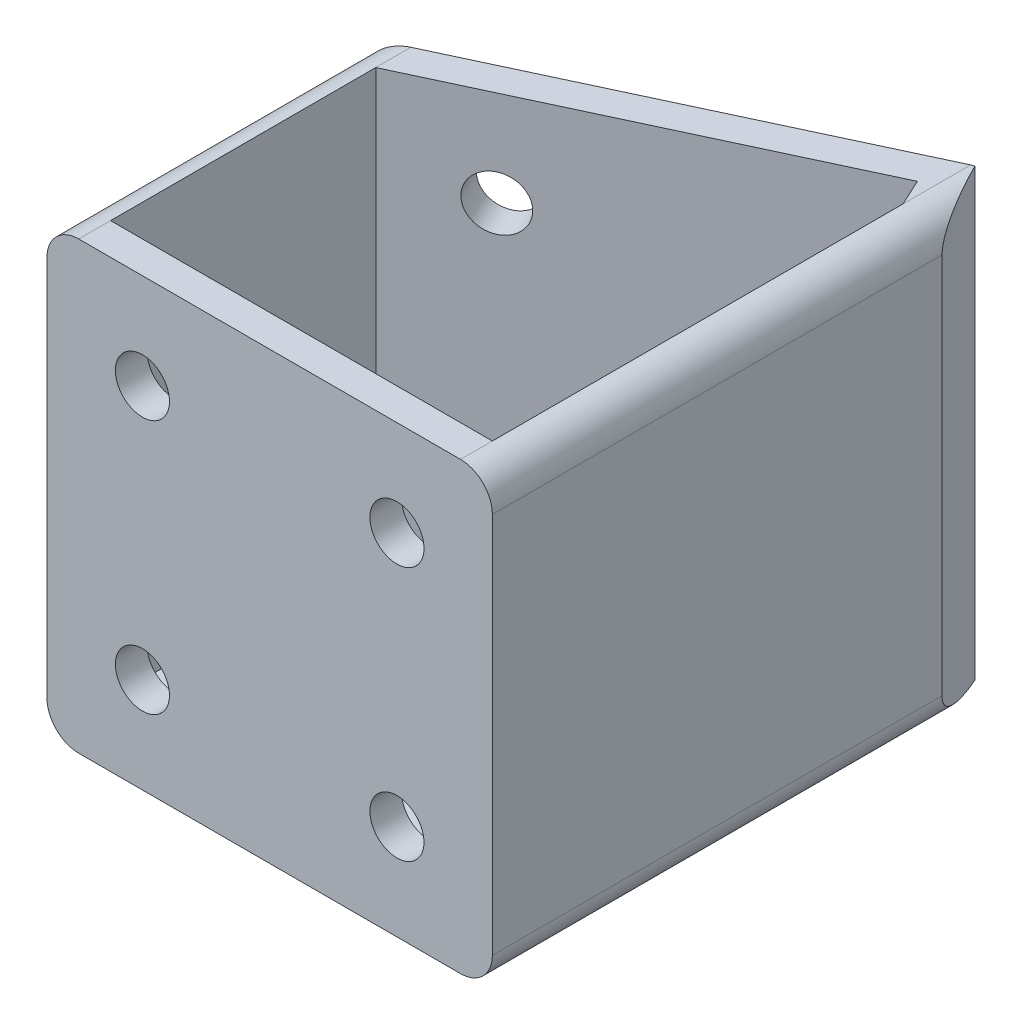
ISO-10303-21;
HEADER;
FILE_DESCRIPTION(('STEP AP214'),'2;1');
FILE_NAME('part.step','',(''),(''),'','','');
FILE_SCHEMA(('AUTOMOTIVE_DESIGN { 1 0 10303 214 1 1 1 1 }'));
ENDSEC;
DATA;
#1=APPLICATION_CONTEXT('core data for automotive mechanical design processes');
#2=APPLICATION_PROTOCOL_DEFINITION('international standard','automotive_design',2000,#1);
#3=PRODUCT_CONTEXT('',#1,'mechanical');
#4=PRODUCT('Part','Part','',(#3));
#5=PRODUCT_RELATED_PRODUCT_CATEGORY('part','',(#4));
#6=PRODUCT_DEFINITION_FORMATION('','',#4);
#7=PRODUCT_DEFINITION_CONTEXT('part definition',#1,'design');
#8=PRODUCT_DEFINITION('design','',#6,#7);
#9=PRODUCT_DEFINITION_SHAPE('','',#8);
#10=(LENGTH_UNIT() NAMED_UNIT(*) SI_UNIT(.MILLI.,.METRE.));
#11=(NAMED_UNIT(*) PLANE_ANGLE_UNIT() SI_UNIT($,.RADIAN.));
#12=(NAMED_UNIT(*) SI_UNIT($,.STERADIAN.) SOLID_ANGLE_UNIT());
#13=UNCERTAINTY_MEASURE_WITH_UNIT(LENGTH_MEASURE(1.E-05),#10,'distance_accuracy_value','');
#14=(GEOMETRIC_REPRESENTATION_CONTEXT(3) GLOBAL_UNCERTAINTY_ASSIGNED_CONTEXT((#13)) GLOBAL_UNIT_ASSIGNED_CONTEXT((#10,
#11,#12)) REPRESENTATION_CONTEXT('',''));
#15=CARTESIAN_POINT('',(0.,0.,0.));
#16=DIRECTION('',(0.,0.,1.));
#17=DIRECTION('',(1.,0.,0.));
#18=AXIS2_PLACEMENT_3D('',#15,#16,#17);
#19=CARTESIAN_POINT('',(-14.,14.,33.));
#20=DIRECTION('',(0.,-1.,0.));
#21=DIRECTION('',(0.,0.,-1.));
#22=AXIS2_PLACEMENT_3D('',#19,#20,#21);
#23=PLANE('',#22);
#24=DIRECTION('',(-0.4226182617407,0.,-0.90630778703665));
#25=VECTOR('',#24,1.);
#26=CARTESIAN_POINT('',(7.87428211965917,14.,-3.67183805487005));
#27=LINE('',#26,#25);
#28=CARTESIAN_POINT('',(12.,14.,5.17579249159087));
#29=VERTEX_POINT('',#28);
#30=CARTESIAN_POINT('',(11.2200053753348,14.,3.5030886210361));
#31=VERTEX_POINT('',#30);
#32=EDGE_CURVE('E170',#29,#31,#27,.T.);
#33=ORIENTED_EDGE('',*,*,#32,.F.);
#34=DIRECTION('',(0.,0.,-1.));
#35=VECTOR('',#34,1.);
#36=CARTESIAN_POINT('',(12.,14.,33.));
#37=LINE('',#36,#35);
#38=CARTESIAN_POINT('',(12.,14.,0.93261531631));
#39=VERTEX_POINT('',#38);
#40=EDGE_CURVE('E238',#29,#39,#37,.T.);
#41=ORIENTED_EDGE('',*,*,#40,.T.);
#42=DIRECTION('',(0.90630778703665,0.,-0.4226182617407));
#43=VECTOR('',#42,1.);
#44=CARTESIAN_POINT('',(-21.6387598470747,14.,16.6186266438378));
#45=LINE('',#44,#43);
#46=CARTESIAN_POINT('',(-12.,14.,12.12399911203));
#47=VERTEX_POINT('',#46);
#48=EDGE_CURVE('E192',#47,#39,#45,.T.);
#49=ORIENTED_EDGE('',*,*,#48,.F.);
#50=DIRECTION('',(0.,0.,-1.));
#51=VECTOR('',#50,1.);
#52=CARTESIAN_POINT('',(-12.,14.,33.));
#53=LINE('',#52,#51);
#54=CARTESIAN_POINT('',(-12.,14.,14.330754949955));
#55=VERTEX_POINT('',#54);
#56=EDGE_CURVE('E235',#47,#55,#53,.F.);
#57=ORIENTED_EDGE('',*,*,#56,.T.);
#58=DIRECTION('',(0.90630778703665,0.,-0.4226182617407));
#59=VECTOR('',#58,1.);
#60=CARTESIAN_POINT('',(-20.7935233235933,14.,18.4312422179111));
#61=LINE('',#60,#59);
#62=EDGE_CURVE('E148',#55,#31,#61,.T.);
#63=ORIENTED_EDGE('',*,*,#62,.T.);
#64=EDGE_LOOP('',(#33,#41,#49,#57,#63));
#65=FACE_BOUND('',#64,.T.);
#66=ADVANCED_FACE('F38',(#65),#23,.F.);
#67=CARTESIAN_POINT('',(14.,14.,33.));
#68=DIRECTION('',(-1.,0.,0.));
#69=DIRECTION('',(0.,-1.,0.));
#70=AXIS2_PLACEMENT_3D('',#67,#68,#69);
#71=PLANE('',#70);
#72=DIRECTION('',(0.,-1.,0.));
#73=VECTOR('',#72,1.);
#74=CARTESIAN_POINT('',(14.,14.,4.73240316630498));
#75=LINE('',#74,#73);
#76=CARTESIAN_POINT('',(14.,12.,4.73240316630498));
#77=VERTEX_POINT('',#76);
#78=CARTESIAN_POINT('',(14.,-12.,4.73240316630498));
#79=VERTEX_POINT('',#78);
#80=EDGE_CURVE('E181',#77,#79,#75,.T.);
#81=ORIENTED_EDGE('',*,*,#80,.F.);
#82=DIRECTION('',(0.,0.,-1.));
#83=VECTOR('',#82,1.);
#84=CARTESIAN_POINT('',(14.,12.,33.));
#85=LINE('',#84,#83);
#86=CARTESIAN_POINT('',(14.,12.,33.));
#87=VERTEX_POINT('',#86);
#88=EDGE_CURVE('E207',#77,#87,#85,.F.);
#89=ORIENTED_EDGE('',*,*,#88,.T.);
#90=DIRECTION('',(0.,1.,0.));
#91=VECTOR('',#90,1.);
#92=CARTESIAN_POINT('',(14.,14.,33.));
#93=LINE('',#92,#91);
#94=CARTESIAN_POINT('',(14.,-12.,33.));
#95=VERTEX_POINT('',#94);
#96=EDGE_CURVE('E195',#95,#87,#93,.T.);
#97=ORIENTED_EDGE('',*,*,#96,.F.);
#98=DIRECTION('',(0.,0.,-1.));
#99=VECTOR('',#98,1.);
#100=CARTESIAN_POINT('',(14.,-12.,33.));
#101=LINE('',#100,#99);
#102=EDGE_CURVE('E209',#95,#79,#101,.T.);
#103=ORIENTED_EDGE('',*,*,#102,.T.);
#104=EDGE_LOOP('',(#81,#89,#97,#103));
#105=FACE_BOUND('',#104,.T.);
#106=ADVANCED_FACE('F273',(#105),#71,.F.);
#107=CARTESIAN_POINT('',(2.50048673219423,0.,5.36231110183285));
#108=DIRECTION('',(-0.4226182617407,0.,-0.90630778703665));
#109=DIRECTION('',(-0.90630778703665,0.,0.4226182617407));
#110=AXIS2_PLACEMENT_3D('',#107,#108,#109);
#111=PLANE('',#110);
#112=CARTESIAN_POINT('',(-7.65584549074345,-8.,10.0982865961551));
#113=DIRECTION('',(-0.4226182617407,0.,-0.90630778703665));
#114=DIRECTION('',(-0.90630778703665,0.,0.4226182617407));
#115=AXIS2_PLACEMENT_3D('',#112,#113,#114);
#116=CIRCLE('',#115,1.59034702456793);
#117=CARTESIAN_POINT('',(-9.09718938319993,-8.,10.7703962912425));
#118=VERTEX_POINT('',#117);
#119=EDGE_CURVE('E337',#118,#118,#116,.T.);
#120=ORIENTED_EDGE('',*,*,#119,.F.);
#121=EDGE_LOOP('',(#120));
#122=FACE_BOUND('',#121,.T.);
#123=CARTESIAN_POINT('',(-7.65584549074345,8.,10.0982865961551));
#124=DIRECTION('',(-0.4226182617407,0.,-0.90630778703665));
#125=DIRECTION('',(-0.90630778703665,0.,0.4226182617407));
#126=AXIS2_PLACEMENT_3D('',#123,#124,#125);
#127=CIRCLE('',#126,1.7);
#128=CARTESIAN_POINT('',(-9.19656872870575,8.,10.8167376411143));
#129=VERTEX_POINT('',#128);
#130=EDGE_CURVE('E341',#129,#129,#127,.T.);
#131=ORIENTED_EDGE('',*,*,#130,.F.);
#132=EDGE_LOOP('',(#131));
#133=FACE_BOUND('',#132,.T.);
#134=CARTESIAN_POINT('',(8.20454078239792,0.,2.70246701569283));
#135=DIRECTION('',(-0.4226182617407,0.,-0.90630778703665));
#136=DIRECTION('',(-0.90630778703665,0.,0.4226182617407));
#137=AXIS2_PLACEMENT_3D('',#134,#135,#136);
#138=CIRCLE('',#137,1.7);
#139=CARTESIAN_POINT('',(6.66381754443561,0.,3.42091806065203));
#140=VERTEX_POINT('',#139);
#141=EDGE_CURVE('E344',#140,#140,#138,.T.);
#142=ORIENTED_EDGE('',*,*,#141,.F.);
#143=EDGE_LOOP('',(#142));
#144=FACE_BOUND('',#143,.T.);
#145=CARTESIAN_POINT('',(12.,12.,0.932615316310004));
#146=DIRECTION('',(-0.4226182617407,0.,-0.90630778703665));
#147=DIRECTION('',(0.90630778703665,0.,-0.4226182617407));
#148=AXIS2_PLACEMENT_3D('',#145,#146,#147);
#149=ELLIPSE('',#148,2.20675583792498,2.);
#150=CARTESIAN_POINT('',(12.1873844259267,13.991202419876,0.845236523481403));
#151=VERTEX_POINT('',#150);
#152=EDGE_CURVE('E216',#39,#151,#149,.T.);
#153=ORIENTED_EDGE('',*,*,#152,.T.);
#154=DIRECTION('',(0.,-1.,0.));
#155=VECTOR('',#154,1.);
#156=CARTESIAN_POINT('',(12.1873844259267,0.,0.8452365234814));
#157=LINE('',#156,#155);
#158=CARTESIAN_POINT('',(12.1873844259267,-13.991202419876,0.8452365234814));
#159=VERTEX_POINT('',#158);
#160=EDGE_CURVE('E61',#151,#159,#157,.T.);
#161=ORIENTED_EDGE('',*,*,#160,.T.);
#162=CARTESIAN_POINT('',(12.,-12.,0.932615316310004));
#163=DIRECTION('',(-0.4226182617407,0.,-0.90630778703665));
#164=DIRECTION('',(0.90630778703665,0.,-0.4226182617407));
#165=AXIS2_PLACEMENT_3D('',#162,#163,#164);
#166=ELLIPSE('',#165,2.20675583792498,2.);
#167=CARTESIAN_POINT('',(12.,-14.,0.93261531631));
#168=VERTEX_POINT('',#167);
#169=EDGE_CURVE('E219',#159,#168,#166,.T.);
#170=ORIENTED_EDGE('',*,*,#169,.T.);
#171=DIRECTION('',(-0.90630778703665,0.,0.4226182617407));
#172=VECTOR('',#171,1.);
#173=CARTESIAN_POINT('',(-21.6387598470747,-14.,16.6186266438378));
#174=LINE('',#173,#172);
#175=CARTESIAN_POINT('',(-12.,-14.,12.12399911203));
#176=VERTEX_POINT('',#175);
#177=EDGE_CURVE('E186',#168,#176,#174,.T.);
#178=ORIENTED_EDGE('',*,*,#177,.T.);
#179=CARTESIAN_POINT('',(-12.,-12.,12.12399911203));
#180=DIRECTION('',(-0.4226182617407,0.,-0.90630778703665));
#181=DIRECTION('',(0.90630778703665,0.,-0.4226182617407));
#182=AXIS2_PLACEMENT_3D('',#179,#180,#181);
#183=ELLIPSE('',#182,2.20675583792498,2.);
#184=CARTESIAN_POINT('',(-14.,-12.,13.05661442834));
#185=VERTEX_POINT('',#184);
#186=EDGE_CURVE('E212',#176,#185,#183,.T.);
#187=ORIENTED_EDGE('',*,*,#186,.T.);
#188=DIRECTION('',(0.,1.,0.));
#189=VECTOR('',#188,1.);
#190=CARTESIAN_POINT('',(-14.,14.,13.05661442834));
#191=LINE('',#190,#189);
#192=CARTESIAN_POINT('',(-14.,12.,13.05661442834));
#193=VERTEX_POINT('',#192);
#194=EDGE_CURVE('E189',#185,#193,#191,.T.);
#195=ORIENTED_EDGE('',*,*,#194,.T.);
#196=CARTESIAN_POINT('',(-12.,12.,12.12399911203));
#197=DIRECTION('',(-0.4226182617407,0.,-0.90630778703665));
#198=DIRECTION('',(0.90630778703665,0.,-0.4226182617407));
#199=AXIS2_PLACEMENT_3D('',#196,#197,#198);
#200=ELLIPSE('',#199,2.20675583792498,2.);
#201=EDGE_CURVE('E214',#193,#47,#200,.T.);
#202=ORIENTED_EDGE('',*,*,#201,.T.);
#203=ORIENTED_EDGE('',*,*,#48,.T.);
#204=EDGE_LOOP('',(#153,#161,#170,#178,#187,#195,#202,#203));
#205=FACE_BOUND('',#204,.T.);
#206=ADVANCED_FACE('F253',(#122,#133,#144,#205),#111,.T.);
#207=CARTESIAN_POINT('',(12.,-12.,33.));
#208=DIRECTION('',(0.,0.,-1.));
#209=DIRECTION('',(-1.,0.,0.));
#210=AXIS2_PLACEMENT_3D('',#207,#208,#209);
#211=CYLINDRICAL_SURFACE('',#210,2.);
#212=ORIENTED_EDGE('',*,*,#169,.F.);
#213=CARTESIAN_POINT('',(12.,-12.,0.44338932528587));
#214=DIRECTION('',(0.90630778703665,0.,-0.4226182617407));
#215=DIRECTION('',(-0.4226182617407,0.,-0.90630778703665));
#216=AXIS2_PLACEMENT_3D('',#213,#214,#215);
#217=ELLIPSE('',#216,4.73240316630499,2.);
#218=EDGE_CURVE('E183',#159,#79,#217,.F.);
#219=ORIENTED_EDGE('',*,*,#218,.T.);
#220=ORIENTED_EDGE('',*,*,#102,.F.);
#221=CARTESIAN_POINT('',(12.,-12.,33.));
#222=DIRECTION('',(0.,0.,1.));
#223=DIRECTION('',(1.,0.,0.));
#224=AXIS2_PLACEMENT_3D('',#221,#222,#223);
#225=CIRCLE('',#224,2.);
#226=CARTESIAN_POINT('',(12.,-14.,33.));
#227=VERTEX_POINT('',#226);
#228=EDGE_CURVE('E232',#227,#95,#225,.T.);
#229=ORIENTED_EDGE('',*,*,#228,.F.);
#230=DIRECTION('',(0.,0.,-1.));
#231=VECTOR('',#230,1.);
#232=CARTESIAN_POINT('',(12.,-14.,33.));
#233=LINE('',#232,#231);
#234=EDGE_CURVE('E224',#168,#227,#233,.F.);
#235=ORIENTED_EDGE('',*,*,#234,.F.);
#236=EDGE_LOOP('',(#212,#219,#220,#229,#235));
#237=FACE_BOUND('',#236,.T.);
#238=ADVANCED_FACE('F270',(#237),#211,.T.);
#239=CARTESIAN_POINT('',(12.,12.,33.));
#240=DIRECTION('',(0.,0.,-1.));
#241=DIRECTION('',(-1.,0.,0.));
#242=AXIS2_PLACEMENT_3D('',#239,#240,#241);
#243=CYLINDRICAL_SURFACE('',#242,2.);
#244=ORIENTED_EDGE('',*,*,#88,.F.);
#245=CARTESIAN_POINT('',(12.,12.,0.443389325285877));
#246=DIRECTION('',(0.90630778703665,0.,-0.4226182617407));
#247=DIRECTION('',(-0.4226182617407,0.,-0.90630778703665));
#248=AXIS2_PLACEMENT_3D('',#245,#246,#247);
#249=ELLIPSE('',#248,4.73240316630499,2.);
#250=EDGE_CURVE('E11',#77,#151,#249,.F.);
#251=ORIENTED_EDGE('',*,*,#250,.T.);
#252=ORIENTED_EDGE('',*,*,#152,.F.);
#253=ORIENTED_EDGE('',*,*,#40,.F.);
#254=DIRECTION('',(0.,0.,-1.));
#255=VECTOR('',#254,1.);
#256=CARTESIAN_POINT('',(12.,14.,33.));
#257=LINE('',#256,#255);
#258=CARTESIAN_POINT('',(12.,14.,31.));
#259=VERTEX_POINT('',#258);
#260=EDGE_CURVE('E172',#259,#29,#257,.T.);
#261=ORIENTED_EDGE('',*,*,#260,.F.);
#262=CARTESIAN_POINT('',(12.,14.,33.));
#263=VERTEX_POINT('',#262);
#264=EDGE_CURVE('E239',#263,#259,#37,.T.);
#265=ORIENTED_EDGE('',*,*,#264,.F.);
#266=CARTESIAN_POINT('',(12.,12.,33.));
#267=DIRECTION('',(0.,0.,1.));
#268=DIRECTION('',(1.,0.,0.));
#269=AXIS2_PLACEMENT_3D('',#266,#267,#268);
#270=CIRCLE('',#269,2.);
#271=EDGE_CURVE('E230',#87,#263,#270,.T.);
#272=ORIENTED_EDGE('',*,*,#271,.F.);
#273=EDGE_LOOP('',(#244,#251,#252,#253,#261,#265,#272));
#274=FACE_BOUND('',#273,.T.);
#275=ADVANCED_FACE('F279',(#274),#243,.T.);
#276=ORIENTED_EDGE('',*,*,#264,.T.);
#277=DIRECTION('',(-1.,0.,0.));
#278=VECTOR('',#277,1.);
#279=CARTESIAN_POINT('',(-14.,14.,31.));
#280=LINE('',#279,#278);
#281=CARTESIAN_POINT('',(-12.,14.,31.));
#282=VERTEX_POINT('',#281);
#283=EDGE_CURVE('E145',#259,#282,#280,.T.);
#284=ORIENTED_EDGE('',*,*,#283,.T.);
#285=CARTESIAN_POINT('',(-12.,14.,33.));
#286=VERTEX_POINT('',#285);
#287=EDGE_CURVE('E234',#282,#286,#53,.F.);
#288=ORIENTED_EDGE('',*,*,#287,.T.);
#289=DIRECTION('',(-1.,0.,0.));
#290=VECTOR('',#289,1.);
#291=CARTESIAN_POINT('',(-14.,14.,33.));
#292=LINE('',#291,#290);
#293=EDGE_CURVE('E198',#263,#286,#292,.T.);
#294=ORIENTED_EDGE('',*,*,#293,.F.);
#295=EDGE_LOOP('',(#276,#284,#288,#294));
#296=FACE_BOUND('',#295,.T.);
#297=ADVANCED_FACE('F282',(#296),#23,.F.);
#298=CARTESIAN_POINT('',(-14.,14.,33.));
#299=DIRECTION('',(1.,0.,0.));
#300=DIRECTION('',(0.,1.,0.));
#301=AXIS2_PLACEMENT_3D('',#298,#299,#300);
#302=PLANE('',#301);
#303=DIRECTION('',(0.,-1.,0.));
#304=VECTOR('',#303,1.);
#305=CARTESIAN_POINT('',(-14.,14.,33.));
#306=LINE('',#305,#304);
#307=CARTESIAN_POINT('',(-14.,12.,33.));
#308=VERTEX_POINT('',#307);
#309=CARTESIAN_POINT('',(-14.,-12.,33.));
#310=VERTEX_POINT('',#309);
#311=EDGE_CURVE('E201',#308,#310,#306,.T.);
#312=ORIENTED_EDGE('',*,*,#311,.F.);
#313=DIRECTION('',(0.,0.,-1.));
#314=VECTOR('',#313,1.);
#315=CARTESIAN_POINT('',(-14.,12.,33.));
#316=LINE('',#315,#314);
#317=EDGE_CURVE('E46',#308,#193,#316,.T.);
#318=ORIENTED_EDGE('',*,*,#317,.T.);
#319=ORIENTED_EDGE('',*,*,#194,.F.);
#320=DIRECTION('',(0.,0.,-1.));
#321=VECTOR('',#320,1.);
#322=CARTESIAN_POINT('',(-14.,-12.,33.));
#323=LINE('',#322,#321);
#324=EDGE_CURVE('E242',#185,#310,#323,.F.);
#325=ORIENTED_EDGE('',*,*,#324,.T.);
#326=EDGE_LOOP('',(#312,#318,#319,#325));
#327=FACE_BOUND('',#326,.T.);
#328=ADVANCED_FACE('F248',(#327),#302,.F.);
#329=CARTESIAN_POINT('',(-14.,-14.,33.));
#330=DIRECTION('',(0.,1.,0.));
#331=DIRECTION('',(0.,0.,1.));
#332=AXIS2_PLACEMENT_3D('',#329,#330,#331);
#333=PLANE('',#332);
#334=ORIENTED_EDGE('',*,*,#177,.F.);
#335=ORIENTED_EDGE('',*,*,#234,.T.);
#336=DIRECTION('',(1.,0.,0.));
#337=VECTOR('',#336,1.);
#338=CARTESIAN_POINT('',(-14.,-14.,33.));
#339=LINE('',#338,#337);
#340=CARTESIAN_POINT('',(-12.,-14.,33.));
#341=VERTEX_POINT('',#340);
#342=EDGE_CURVE('E204',#341,#227,#339,.T.);
#343=ORIENTED_EDGE('',*,*,#342,.F.);
#344=DIRECTION('',(0.,0.,-1.));
#345=VECTOR('',#344,1.);
#346=CARTESIAN_POINT('',(-12.,-14.,33.));
#347=LINE('',#346,#345);
#348=EDGE_CURVE('E221',#341,#176,#347,.T.);
#349=ORIENTED_EDGE('',*,*,#348,.T.);
#350=EDGE_LOOP('',(#334,#335,#343,#349));
#351=FACE_BOUND('',#350,.T.);
#352=ADVANCED_FACE('F261',(#351),#333,.F.);
#353=CARTESIAN_POINT('',(0.,0.,33.));
#354=DIRECTION('',(0.,0.,1.));
#355=DIRECTION('',(1.,0.,0.));
#356=AXIS2_PLACEMENT_3D('',#353,#354,#355);
#357=PLANE('',#356);
#358=CARTESIAN_POINT('',(-8.00000000000008,-7.99999999999992,33.));
#359=DIRECTION('',(0.,0.,1.));
#360=DIRECTION('',(1.,0.,0.));
#361=AXIS2_PLACEMENT_3D('',#358,#359,#360);
#362=CIRCLE('',#361,1.7);
#363=CARTESIAN_POINT('',(-6.30000000000008,-7.99999999999992,33.));
#364=VERTEX_POINT('',#363);
#365=EDGE_CURVE('E368',#364,#364,#362,.T.);
#366=ORIENTED_EDGE('',*,*,#365,.F.);
#367=EDGE_LOOP('',(#366));
#368=FACE_BOUND('',#367,.T.);
#369=CARTESIAN_POINT('',(7.99999999999984,-7.99999999999999,33.));
#370=DIRECTION('',(0.,0.,1.));
#371=DIRECTION('',(1.,0.,0.));
#372=AXIS2_PLACEMENT_3D('',#369,#370,#371);
#373=CIRCLE('',#372,1.69999999999992);
#374=CARTESIAN_POINT('',(9.69999999999976,-7.99999999999999,33.));
#375=VERTEX_POINT('',#374);
#376=EDGE_CURVE('E362',#375,#375,#373,.T.);
#377=ORIENTED_EDGE('',*,*,#376,.F.);
#378=EDGE_LOOP('',(#377));
#379=FACE_BOUND('',#378,.T.);
#380=CARTESIAN_POINT('',(7.99999999999992,7.99999999999992,33.));
#381=DIRECTION('',(0.,0.,1.));
#382=DIRECTION('',(1.,0.,0.));
#383=AXIS2_PLACEMENT_3D('',#380,#381,#382);
#384=CIRCLE('',#383,1.69999999999998);
#385=CARTESIAN_POINT('',(9.6999999999999,7.99999999999992,33.));
#386=VERTEX_POINT('',#385);
#387=EDGE_CURVE('E356',#386,#386,#384,.T.);
#388=ORIENTED_EDGE('',*,*,#387,.F.);
#389=EDGE_LOOP('',(#388));
#390=FACE_BOUND('',#389,.T.);
#391=CARTESIAN_POINT('',(-8.,8.,33.));
#392=DIRECTION('',(0.,0.,1.));
#393=DIRECTION('',(1.,0.,0.));
#394=AXIS2_PLACEMENT_3D('',#391,#392,#393);
#395=CIRCLE('',#394,1.7);
#396=CARTESIAN_POINT('',(-6.3,8.,33.));
#397=VERTEX_POINT('',#396);
#398=EDGE_CURVE('E355',#397,#397,#395,.T.);
#399=ORIENTED_EDGE('',*,*,#398,.F.);
#400=EDGE_LOOP('',(#399));
#401=FACE_BOUND('',#400,.T.);
#402=ORIENTED_EDGE('',*,*,#342,.T.);
#403=ORIENTED_EDGE('',*,*,#228,.T.);
#404=ORIENTED_EDGE('',*,*,#96,.T.);
#405=ORIENTED_EDGE('',*,*,#271,.T.);
#406=ORIENTED_EDGE('',*,*,#293,.T.);
#407=CARTESIAN_POINT('',(-12.,12.,33.));
#408=DIRECTION('',(0.,0.,1.));
#409=DIRECTION('',(1.,0.,0.));
#410=AXIS2_PLACEMENT_3D('',#407,#408,#409);
#411=CIRCLE('',#410,2.);
#412=EDGE_CURVE('E228',#286,#308,#411,.T.);
#413=ORIENTED_EDGE('',*,*,#412,.T.);
#414=ORIENTED_EDGE('',*,*,#311,.T.);
#415=CARTESIAN_POINT('',(-12.,-12.,33.));
#416=DIRECTION('',(0.,0.,1.));
#417=DIRECTION('',(1.,0.,0.));
#418=AXIS2_PLACEMENT_3D('',#415,#416,#417);
#419=CIRCLE('',#418,2.);
#420=EDGE_CURVE('E226',#310,#341,#419,.T.);
#421=ORIENTED_EDGE('',*,*,#420,.T.);
#422=EDGE_LOOP('',(#402,#403,#404,#405,#406,#413,#414,#421));
#423=FACE_BOUND('',#422,.T.);
#424=ADVANCED_FACE('F265',(#368,#379,#390,#401,#423),#357,.T.);
#425=CARTESIAN_POINT('',(-12.,12.,33.));
#426=DIRECTION('',(0.,0.,-1.));
#427=DIRECTION('',(-1.,0.,0.));
#428=AXIS2_PLACEMENT_3D('',#425,#426,#427);
#429=CYLINDRICAL_SURFACE('',#428,2.);
#430=ORIENTED_EDGE('',*,*,#412,.F.);
#431=ORIENTED_EDGE('',*,*,#287,.F.);
#432=DIRECTION('',(0.,0.,1.));
#433=VECTOR('',#432,1.);
#434=CARTESIAN_POINT('',(-12.,14.,33.));
#435=LINE('',#434,#433);
#436=EDGE_CURVE('E171',#55,#282,#435,.T.);
#437=ORIENTED_EDGE('',*,*,#436,.F.);
#438=ORIENTED_EDGE('',*,*,#56,.F.);
#439=ORIENTED_EDGE('',*,*,#201,.F.);
#440=ORIENTED_EDGE('',*,*,#317,.F.);
#441=EDGE_LOOP('',(#430,#431,#437,#438,#439,#440));
#442=FACE_BOUND('',#441,.T.);
#443=ADVANCED_FACE('F284',(#442),#429,.T.);
#444=CARTESIAN_POINT('',(-12.,-12.,33.));
#445=DIRECTION('',(0.,0.,-1.));
#446=DIRECTION('',(-1.,0.,0.));
#447=AXIS2_PLACEMENT_3D('',#444,#445,#446);
#448=CYLINDRICAL_SURFACE('',#447,2.);
#449=ORIENTED_EDGE('',*,*,#420,.F.);
#450=ORIENTED_EDGE('',*,*,#324,.F.);
#451=ORIENTED_EDGE('',*,*,#186,.F.);
#452=ORIENTED_EDGE('',*,*,#348,.F.);
#453=EDGE_LOOP('',(#449,#450,#451,#452));
#454=FACE_BOUND('',#453,.T.);
#455=ADVANCED_FACE('F40',(#454),#448,.T.);
#456=CARTESIAN_POINT('',(9.68689769373247,0.,-4.51707457835146));
#457=DIRECTION('',(0.90630778703665,0.,-0.4226182617407));
#458=DIRECTION('',(-0.4226182617407,0.,-0.90630778703665));
#459=AXIS2_PLACEMENT_3D('',#456,#457,#458);
#460=PLANE('',#459);
#461=ORIENTED_EDGE('',*,*,#160,.F.);
#462=ORIENTED_EDGE('',*,*,#250,.F.);
#463=ORIENTED_EDGE('',*,*,#80,.T.);
#464=ORIENTED_EDGE('',*,*,#218,.F.);
#465=EDGE_LOOP('',(#461,#462,#463,#464));
#466=FACE_BOUND('',#465,.T.);
#467=ADVANCED_FACE('F290',(#466),#460,.T.);
#468=CARTESIAN_POINT('',(12.,14.,33.));
#469=DIRECTION('',(-1.,0.,0.));
#470=DIRECTION('',(0.,-1.,0.));
#471=AXIS2_PLACEMENT_3D('',#468,#469,#470);
#472=PLANE('',#471);
#473=DIRECTION('',(0.,-1.,0.));
#474=VECTOR('',#473,1.);
#475=CARTESIAN_POINT('',(12.,14.,5.17579249159086));
#476=LINE('',#475,#474);
#477=CARTESIAN_POINT('',(12.,-12.,5.17579249159086));
#478=VERTEX_POINT('',#477);
#479=EDGE_CURVE('E155',#29,#478,#476,.T.);
#480=ORIENTED_EDGE('',*,*,#479,.T.);
#481=DIRECTION('',(0.,0.,-1.));
#482=VECTOR('',#481,1.);
#483=CARTESIAN_POINT('',(12.,-12.,33.));
#484=LINE('',#483,#482);
#485=CARTESIAN_POINT('',(12.,-12.,31.));
#486=VERTEX_POINT('',#485);
#487=EDGE_CURVE('E152',#486,#478,#484,.T.);
#488=ORIENTED_EDGE('',*,*,#487,.F.);
#489=DIRECTION('',(0.,1.,0.));
#490=VECTOR('',#489,1.);
#491=CARTESIAN_POINT('',(12.,14.,31.));
#492=LINE('',#491,#490);
#493=EDGE_CURVE('E138',#486,#259,#492,.T.);
#494=ORIENTED_EDGE('',*,*,#493,.T.);
#495=ORIENTED_EDGE('',*,*,#260,.T.);
#496=EDGE_LOOP('',(#480,#488,#494,#495));
#497=FACE_BOUND('',#496,.T.);
#498=ADVANCED_FACE('F153',(#497),#472,.T.);
#499=CARTESIAN_POINT('',(3.34572325567563,0.,7.17492667590615));
#500=DIRECTION('',(-0.4226182617407,0.,-0.90630778703665));
#501=DIRECTION('',(-0.90630778703665,0.,0.4226182617407));
#502=AXIS2_PLACEMENT_3D('',#499,#500,#501);
#503=PLANE('',#502);
#504=CARTESIAN_POINT('',(-6.81060896726205,-8.,11.9109021702284));
#505=DIRECTION('',(-0.4226182617407,0.,-0.90630778703665));
#506=DIRECTION('',(-0.90630778703665,0.,0.4226182617407));
#507=AXIS2_PLACEMENT_3D('',#504,#505,#506);
#508=CIRCLE('',#507,1.59034702456793);
#509=CARTESIAN_POINT('',(-8.25195285971853,-8.,12.5830118653158));
#510=VERTEX_POINT('',#509);
#511=EDGE_CURVE('E371',#510,#510,#508,.T.);
#512=ORIENTED_EDGE('',*,*,#511,.T.);
#513=EDGE_LOOP('',(#512));
#514=FACE_BOUND('',#513,.T.);
#515=CARTESIAN_POINT('',(-6.81060896726205,8.,11.9109021702284));
#516=DIRECTION('',(-0.4226182617407,0.,-0.90630778703665));
#517=DIRECTION('',(-0.90630778703665,0.,0.4226182617407));
#518=AXIS2_PLACEMENT_3D('',#515,#516,#517);
#519=CIRCLE('',#518,1.7);
#520=CARTESIAN_POINT('',(-8.35133220522435,8.,12.6293532151876));
#521=VERTEX_POINT('',#520);
#522=EDGE_CURVE('E433',#521,#521,#519,.T.);
#523=ORIENTED_EDGE('',*,*,#522,.T.);
#524=EDGE_LOOP('',(#523));
#525=FACE_BOUND('',#524,.T.);
#526=CARTESIAN_POINT('',(9.04977730587932,0.,4.51508258976613));
#527=DIRECTION('',(-0.4226182617407,0.,-0.90630778703665));
#528=DIRECTION('',(-0.90630778703665,0.,0.4226182617407));
#529=AXIS2_PLACEMENT_3D('',#526,#527,#528);
#530=CIRCLE('',#529,1.7);
#531=CARTESIAN_POINT('',(7.50905406791701,0.,5.23353363472532));
#532=VERTEX_POINT('',#531);
#533=EDGE_CURVE('E346',#532,#532,#530,.T.);
#534=ORIENTED_EDGE('',*,*,#533,.T.);
#535=EDGE_LOOP('',(#534));
#536=FACE_BOUND('',#535,.T.);
#537=ORIENTED_EDGE('',*,*,#62,.F.);
#538=DIRECTION('',(0.,1.,0.));
#539=VECTOR('',#538,1.);
#540=CARTESIAN_POINT('',(-12.,14.,14.330754949955));
#541=LINE('',#540,#539);
#542=CARTESIAN_POINT('',(-12.,-12.,14.330754949955));
#543=VERTEX_POINT('',#542);
#544=EDGE_CURVE('E53',#543,#55,#541,.T.);
#545=ORIENTED_EDGE('',*,*,#544,.F.);
#546=DIRECTION('',(-0.90630778703665,0.,0.4226182617407));
#547=VECTOR('',#546,1.);
#548=CARTESIAN_POINT('',(-20.7935233235933,-12.,18.4312422179111));
#549=LINE('',#548,#547);
#550=CARTESIAN_POINT('',(11.2200053753348,-12.,3.5030886210361));
#551=VERTEX_POINT('',#550);
#552=EDGE_CURVE('E378',#551,#543,#549,.T.);
#553=ORIENTED_EDGE('',*,*,#552,.F.);
#554=DIRECTION('',(0.,-1.,0.));
#555=VECTOR('',#554,1.);
#556=CARTESIAN_POINT('',(11.2200053753348,0.,3.5030886210361));
#557=LINE('',#556,#555);
#558=EDGE_CURVE('E375',#31,#551,#557,.T.);
#559=ORIENTED_EDGE('',*,*,#558,.F.);
#560=EDGE_LOOP('',(#537,#545,#553,#559));
#561=FACE_BOUND('',#560,.T.);
#562=ADVANCED_FACE('F297',(#514,#525,#536,#561),#503,.F.);
#563=CARTESIAN_POINT('',(-12.,14.,33.));
#564=DIRECTION('',(1.,0.,0.));
#565=DIRECTION('',(0.,1.,0.));
#566=AXIS2_PLACEMENT_3D('',#563,#564,#565);
#567=PLANE('',#566);
#568=DIRECTION('',(0.,-1.,0.));
#569=VECTOR('',#568,1.);
#570=CARTESIAN_POINT('',(-12.,14.,31.));
#571=LINE('',#570,#569);
#572=CARTESIAN_POINT('',(-12.,-12.,31.));
#573=VERTEX_POINT('',#572);
#574=EDGE_CURVE('E163',#282,#573,#571,.T.);
#575=ORIENTED_EDGE('',*,*,#574,.T.);
#576=DIRECTION('',(0.,0.,1.));
#577=VECTOR('',#576,1.);
#578=CARTESIAN_POINT('',(-12.,-12.,33.));
#579=LINE('',#578,#577);
#580=EDGE_CURVE('E158',#543,#573,#579,.T.);
#581=ORIENTED_EDGE('',*,*,#580,.F.);
#582=ORIENTED_EDGE('',*,*,#544,.T.);
#583=ORIENTED_EDGE('',*,*,#436,.T.);
#584=EDGE_LOOP('',(#575,#581,#582,#583));
#585=FACE_BOUND('',#584,.T.);
#586=ADVANCED_FACE('F400',(#585),#567,.T.);
#587=CARTESIAN_POINT('',(-14.,-12.,33.));
#588=DIRECTION('',(0.,1.,0.));
#589=DIRECTION('',(0.,0.,1.));
#590=AXIS2_PLACEMENT_3D('',#587,#588,#589);
#591=PLANE('',#590);
#592=ORIENTED_EDGE('',*,*,#552,.T.);
#593=ORIENTED_EDGE('',*,*,#580,.T.);
#594=DIRECTION('',(1.,0.,0.));
#595=VECTOR('',#594,1.);
#596=CARTESIAN_POINT('',(-14.,-12.,31.));
#597=LINE('',#596,#595);
#598=EDGE_CURVE('E142',#573,#486,#597,.T.);
#599=ORIENTED_EDGE('',*,*,#598,.T.);
#600=ORIENTED_EDGE('',*,*,#487,.T.);
#601=DIRECTION('',(-0.4226182617407,0.,-0.90630778703665));
#602=VECTOR('',#601,1.);
#603=CARTESIAN_POINT('',(18.0135286989281,-12.,18.071846403125));
#604=LINE('',#603,#602);
#605=EDGE_CURVE('E168',#478,#551,#604,.T.);
#606=ORIENTED_EDGE('',*,*,#605,.T.);
#607=EDGE_LOOP('',(#592,#593,#599,#600,#606));
#608=FACE_BOUND('',#607,.T.);
#609=ADVANCED_FACE('F161',(#608),#591,.T.);
#610=CARTESIAN_POINT('',(0.,0.,31.));
#611=DIRECTION('',(0.,0.,1.));
#612=DIRECTION('',(1.,0.,0.));
#613=AXIS2_PLACEMENT_3D('',#610,#611,#612);
#614=PLANE('',#613);
#615=CARTESIAN_POINT('',(-8.00000000000008,-7.99999999999992,31.));
#616=DIRECTION('',(0.,0.,1.));
#617=DIRECTION('',(1.,0.,0.));
#618=AXIS2_PLACEMENT_3D('',#615,#616,#617);
#619=CIRCLE('',#618,1.7);
#620=CARTESIAN_POINT('',(-6.30000000000008,-7.99999999999992,31.));
#621=VERTEX_POINT('',#620);
#622=EDGE_CURVE('E365',#621,#621,#619,.T.);
#623=ORIENTED_EDGE('',*,*,#622,.T.);
#624=EDGE_LOOP('',(#623));
#625=FACE_BOUND('',#624,.T.);
#626=CARTESIAN_POINT('',(7.99999999999984,-7.99999999999999,31.));
#627=DIRECTION('',(0.,0.,1.));
#628=DIRECTION('',(1.,0.,0.));
#629=AXIS2_PLACEMENT_3D('',#626,#627,#628);
#630=CIRCLE('',#629,1.69999999999992);
#631=CARTESIAN_POINT('',(9.69999999999976,-7.99999999999999,31.));
#632=VERTEX_POINT('',#631);
#633=EDGE_CURVE('E359',#632,#632,#630,.T.);
#634=ORIENTED_EDGE('',*,*,#633,.T.);
#635=EDGE_LOOP('',(#634));
#636=FACE_BOUND('',#635,.T.);
#637=CARTESIAN_POINT('',(7.99999999999992,7.99999999999992,31.));
#638=DIRECTION('',(0.,0.,1.));
#639=DIRECTION('',(1.,0.,0.));
#640=AXIS2_PLACEMENT_3D('',#637,#638,#639);
#641=CIRCLE('',#640,1.69999999999998);
#642=CARTESIAN_POINT('',(9.6999999999999,7.99999999999992,31.));
#643=VERTEX_POINT('',#642);
#644=EDGE_CURVE('E352',#643,#643,#641,.T.);
#645=ORIENTED_EDGE('',*,*,#644,.T.);
#646=EDGE_LOOP('',(#645));
#647=FACE_BOUND('',#646,.T.);
#648=CARTESIAN_POINT('',(-8.,8.,31.));
#649=DIRECTION('',(0.,0.,1.));
#650=DIRECTION('',(1.,0.,0.));
#651=AXIS2_PLACEMENT_3D('',#648,#649,#650);
#652=CIRCLE('',#651,1.7);
#653=CARTESIAN_POINT('',(-6.3,8.,31.));
#654=VERTEX_POINT('',#653);
#655=EDGE_CURVE('E372',#654,#654,#652,.T.);
#656=ORIENTED_EDGE('',*,*,#655,.T.);
#657=EDGE_LOOP('',(#656));
#658=FACE_BOUND('',#657,.T.);
#659=ORIENTED_EDGE('',*,*,#598,.F.);
#660=ORIENTED_EDGE('',*,*,#574,.F.);
#661=ORIENTED_EDGE('',*,*,#283,.F.);
#662=ORIENTED_EDGE('',*,*,#493,.F.);
#663=EDGE_LOOP('',(#659,#660,#661,#662));
#664=FACE_BOUND('',#663,.T.);
#665=ADVANCED_FACE('F140',(#625,#636,#647,#658,#664),#614,.F.);
#666=CARTESIAN_POINT('',(7.87428211965917,0.,-3.67183805487006));
#667=DIRECTION('',(0.90630778703665,0.,-0.4226182617407));
#668=DIRECTION('',(-0.4226182617407,0.,-0.90630778703665));
#669=AXIS2_PLACEMENT_3D('',#666,#667,#668);
#670=PLANE('',#669);
#671=ORIENTED_EDGE('',*,*,#558,.T.);
#672=ORIENTED_EDGE('',*,*,#605,.F.);
#673=ORIENTED_EDGE('',*,*,#479,.F.);
#674=ORIENTED_EDGE('',*,*,#32,.T.);
#675=EDGE_LOOP('',(#671,#672,#673,#674));
#676=FACE_BOUND('',#675,.T.);
#677=ADVANCED_FACE('F385',(#676),#670,.F.);
#678=CARTESIAN_POINT('',(-8.,8.,31.));
#679=DIRECTION('',(0.,0.,1.));
#680=DIRECTION('',(1.,0.,0.));
#681=AXIS2_PLACEMENT_3D('',#678,#679,#680);
#682=CYLINDRICAL_SURFACE('',#681,1.7);
#683=ORIENTED_EDGE('',*,*,#655,.F.);
#684=EDGE_LOOP('',(#683));
#685=FACE_BOUND('',#684,.T.);
#686=ORIENTED_EDGE('',*,*,#398,.T.);
#687=EDGE_LOOP('',(#686));
#688=FACE_BOUND('',#687,.T.);
#689=ADVANCED_FACE('F387',(#685,#688),#682,.F.);
#690=CARTESIAN_POINT('',(7.99999999999992,7.99999999999992,31.));
#691=DIRECTION('',(0.,0.,1.));
#692=DIRECTION('',(1.,0.,0.));
#693=AXIS2_PLACEMENT_3D('',#690,#691,#692);
#694=CYLINDRICAL_SURFACE('',#693,1.69999999999998);
#695=ORIENTED_EDGE('',*,*,#644,.F.);
#696=EDGE_LOOP('',(#695));
#697=FACE_BOUND('',#696,.T.);
#698=ORIENTED_EDGE('',*,*,#387,.T.);
#699=EDGE_LOOP('',(#698));
#700=FACE_BOUND('',#699,.T.);
#701=ADVANCED_FACE('F392',(#697,#700),#694,.F.);
#702=CARTESIAN_POINT('',(7.99999999999984,-7.99999999999999,31.));
#703=DIRECTION('',(0.,0.,1.));
#704=DIRECTION('',(1.,0.,0.));
#705=AXIS2_PLACEMENT_3D('',#702,#703,#704);
#706=CYLINDRICAL_SURFACE('',#705,1.69999999999992);
#707=ORIENTED_EDGE('',*,*,#633,.F.);
#708=EDGE_LOOP('',(#707));
#709=FACE_BOUND('',#708,.T.);
#710=ORIENTED_EDGE('',*,*,#376,.T.);
#711=EDGE_LOOP('',(#710));
#712=FACE_BOUND('',#711,.T.);
#713=ADVANCED_FACE('F410',(#709,#712),#706,.F.);
#714=CARTESIAN_POINT('',(-8.00000000000008,-7.99999999999992,31.));
#715=DIRECTION('',(0.,0.,1.));
#716=DIRECTION('',(1.,0.,0.));
#717=AXIS2_PLACEMENT_3D('',#714,#715,#716);
#718=CYLINDRICAL_SURFACE('',#717,1.7);
#719=ORIENTED_EDGE('',*,*,#622,.F.);
#720=EDGE_LOOP('',(#719));
#721=FACE_BOUND('',#720,.T.);
#722=ORIENTED_EDGE('',*,*,#365,.T.);
#723=EDGE_LOOP('',(#722));
#724=FACE_BOUND('',#723,.T.);
#725=ADVANCED_FACE('F406',(#721,#724),#718,.F.);
#726=CARTESIAN_POINT('',(9.04977730587932,0.,4.51508258976613));
#727=DIRECTION('',(-0.4226182617407,0.,-0.90630778703665));
#728=DIRECTION('',(-0.90630778703665,0.,0.4226182617407));
#729=AXIS2_PLACEMENT_3D('',#726,#727,#728);
#730=CYLINDRICAL_SURFACE('',#729,1.7);
#731=ORIENTED_EDGE('',*,*,#533,.F.);
#732=EDGE_LOOP('',(#731));
#733=FACE_BOUND('',#732,.T.);
#734=ORIENTED_EDGE('',*,*,#141,.T.);
#735=EDGE_LOOP('',(#734));
#736=FACE_BOUND('',#735,.T.);
#737=ADVANCED_FACE('F409',(#733,#736),#730,.F.);
#738=CARTESIAN_POINT('',(-6.81060896726205,8.,11.9109021702284));
#739=DIRECTION('',(-0.4226182617407,0.,-0.90630778703665));
#740=DIRECTION('',(-0.90630778703665,0.,0.4226182617407));
#741=AXIS2_PLACEMENT_3D('',#738,#739,#740);
#742=CYLINDRICAL_SURFACE('',#741,1.7);
#743=ORIENTED_EDGE('',*,*,#522,.F.);
#744=EDGE_LOOP('',(#743));
#745=FACE_BOUND('',#744,.T.);
#746=ORIENTED_EDGE('',*,*,#130,.T.);
#747=EDGE_LOOP('',(#746));
#748=FACE_BOUND('',#747,.T.);
#749=ADVANCED_FACE('F420',(#745,#748),#742,.F.);
#750=CARTESIAN_POINT('',(-6.81060896726205,-8.,11.9109021702284));
#751=DIRECTION('',(-0.4226182617407,0.,-0.90630778703665));
#752=DIRECTION('',(-0.90630778703665,0.,0.4226182617407));
#753=AXIS2_PLACEMENT_3D('',#750,#751,#752);
#754=CYLINDRICAL_SURFACE('',#753,1.59034702456793);
#755=ORIENTED_EDGE('',*,*,#511,.F.);
#756=EDGE_LOOP('',(#755));
#757=FACE_BOUND('',#756,.T.);
#758=ORIENTED_EDGE('',*,*,#119,.T.);
#759=EDGE_LOOP('',(#758));
#760=FACE_BOUND('',#759,.T.);
#761=ADVANCED_FACE('F424',(#757,#760),#754,.F.);
#762=CLOSED_SHELL('',(#66,#106,#206,#238,#275,#297,#328,#352,#424,#443,#455,#467,#498,#562,#586,
#609,#665,#677,#689,#701,#713,#725,#737,#749,#761));
#763=MANIFOLD_SOLID_BREP('B2',#762);
#764=ADVANCED_BREP_SHAPE_REPRESENTATION('',(#18,#763),#14);
#765=SHAPE_DEFINITION_REPRESENTATION(#9,#764);
ENDSEC;
END-ISO-10303-21;
